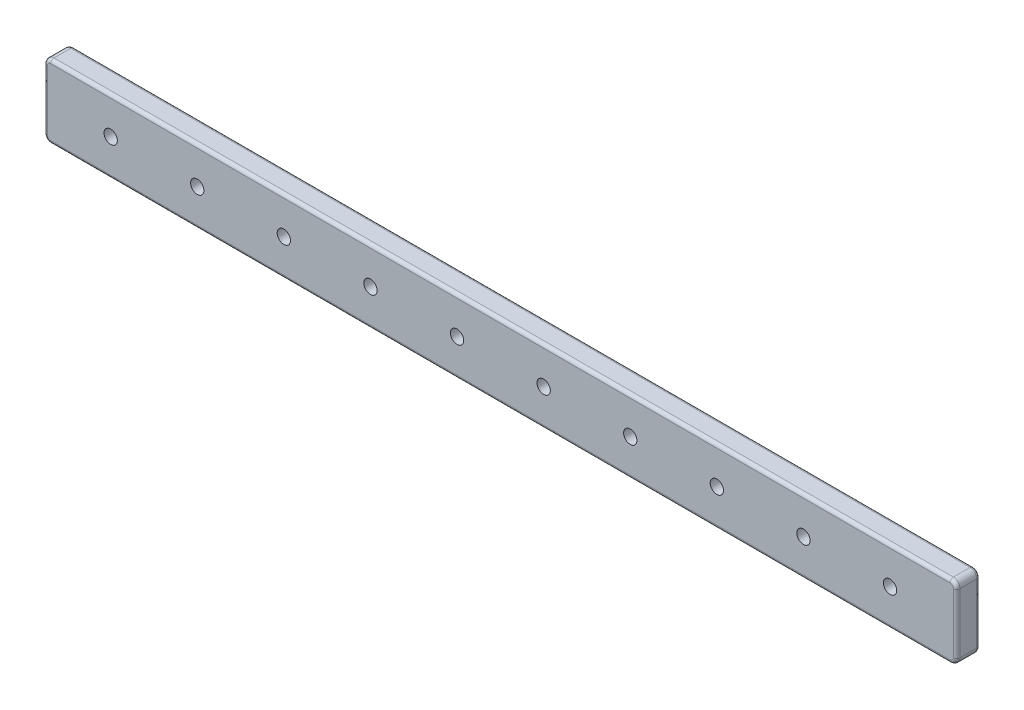
ISO-10303-21;
HEADER;
FILE_DESCRIPTION(('STEP AP214'),'2;1');
FILE_NAME('part.step','',(''),(''),'','','');
FILE_SCHEMA(('AUTOMOTIVE_DESIGN { 1 0 10303 214 1 1 1 1 }'));
ENDSEC;
DATA;
#1=APPLICATION_CONTEXT('core data for automotive mechanical design processes');
#2=APPLICATION_PROTOCOL_DEFINITION('international standard','automotive_design',2000,#1);
#3=PRODUCT_CONTEXT('',#1,'mechanical');
#4=PRODUCT('Part','Part','',(#3));
#5=PRODUCT_RELATED_PRODUCT_CATEGORY('part','',(#4));
#6=PRODUCT_DEFINITION_FORMATION('','',#4);
#7=PRODUCT_DEFINITION_CONTEXT('part definition',#1,'design');
#8=PRODUCT_DEFINITION('design','',#6,#7);
#9=PRODUCT_DEFINITION_SHAPE('','',#8);
#10=(LENGTH_UNIT() NAMED_UNIT(*) SI_UNIT(.MILLI.,.METRE.));
#11=(NAMED_UNIT(*) PLANE_ANGLE_UNIT() SI_UNIT($,.RADIAN.));
#12=(NAMED_UNIT(*) SI_UNIT($,.STERADIAN.) SOLID_ANGLE_UNIT());
#13=UNCERTAINTY_MEASURE_WITH_UNIT(LENGTH_MEASURE(1.E-05),#10,'distance_accuracy_value','');
#14=(GEOMETRIC_REPRESENTATION_CONTEXT(3) GLOBAL_UNCERTAINTY_ASSIGNED_CONTEXT((#13)) GLOBAL_UNIT_ASSIGNED_CONTEXT((#10,
#11,#12)) REPRESENTATION_CONTEXT('',''));
#15=CARTESIAN_POINT('',(0.,0.,0.));
#16=DIRECTION('',(0.,0.,1.));
#17=DIRECTION('',(1.,0.,0.));
#18=AXIS2_PLACEMENT_3D('',#15,#16,#17);
#19=CARTESIAN_POINT('',(-42.7961904761905,15.1352380952381,3.5));
#20=DIRECTION('',(1.,0.,0.));
#21=DIRECTION('',(0.,0.,-1.));
#22=AXIS2_PLACEMENT_3D('',#19,#20,#21);
#23=PLANE('',#22);
#24=DIRECTION('',(0.,0.,-1.));
#25=VECTOR('',#24,1.);
#26=CARTESIAN_POINT('',(-42.7961904761905,14.1352380952381,0.));
#27=LINE('',#26,#25);
#28=CARTESIAN_POINT('',(-42.7961904761905,14.1352380952381,3.));
#29=VERTEX_POINT('',#28);
#30=CARTESIAN_POINT('',(-42.7961904761905,14.1352380952381,0.5));
#31=VERTEX_POINT('',#30);
#32=EDGE_CURVE('E302',#29,#31,#27,.T.);
#33=ORIENTED_EDGE('',*,*,#32,.T.);
#34=DIRECTION('',(0.,-1.,0.));
#35=VECTOR('',#34,1.);
#36=CARTESIAN_POINT('',(-42.7961904761905,15.1352380952381,0.5));
#37=LINE('',#36,#35);
#38=CARTESIAN_POINT('',(-42.7961904761905,5.1352380952381,0.5));
#39=VERTEX_POINT('',#38);
#40=EDGE_CURVE('E200',#31,#39,#37,.T.);
#41=ORIENTED_EDGE('',*,*,#40,.T.);
#42=DIRECTION('',(0.,0.,-1.));
#43=VECTOR('',#42,1.);
#44=CARTESIAN_POINT('',(-42.7961904761905,5.1352380952381,3.5));
#45=LINE('',#44,#43);
#46=CARTESIAN_POINT('',(-42.7961904761905,5.1352380952381,3.));
#47=VERTEX_POINT('',#46);
#48=EDGE_CURVE('E312',#39,#47,#45,.F.);
#49=ORIENTED_EDGE('',*,*,#48,.T.);
#50=DIRECTION('',(0.,-1.,0.));
#51=VECTOR('',#50,1.);
#52=CARTESIAN_POINT('',(-42.7961904761905,14.1352380952381,3.));
#53=LINE('',#52,#51);
#54=EDGE_CURVE('E198',#47,#29,#53,.F.);
#55=ORIENTED_EDGE('',*,*,#54,.T.);
#56=EDGE_LOOP('',(#33,#41,#49,#55));
#57=FACE_BOUND('',#56,.T.);
#58=ADVANCED_FACE('F46',(#57),#23,.F.);
#59=CARTESIAN_POINT('',(-42.7961904761905,4.13523809523809,3.5));
#60=DIRECTION('',(0.,1.,0.));
#61=DIRECTION('',(0.,0.,1.));
#62=AXIS2_PLACEMENT_3D('',#59,#60,#61);
#63=PLANE('',#62);
#64=DIRECTION('',(0.,0.,-1.));
#65=VECTOR('',#64,1.);
#66=CARTESIAN_POINT('',(-41.7961904761905,4.13523809523809,3.5));
#67=LINE('',#66,#65);
#68=CARTESIAN_POINT('',(-41.7961904761905,4.13523809523809,3.));
#69=VERTEX_POINT('',#68);
#70=CARTESIAN_POINT('',(-41.7961904761905,4.13523809523809,0.5));
#71=VERTEX_POINT('',#70);
#72=EDGE_CURVE('E299',#69,#71,#67,.T.);
#73=ORIENTED_EDGE('',*,*,#72,.T.);
#74=DIRECTION('',(1.,0.,0.));
#75=VECTOR('',#74,1.);
#76=CARTESIAN_POINT('',(-42.7961904761905,4.13523809523809,0.5));
#77=LINE('',#76,#75);
#78=CARTESIAN_POINT('',(93.2038095238095,4.13523809523809,0.5));
#79=VERTEX_POINT('',#78);
#80=EDGE_CURVE('E208',#71,#79,#77,.T.);
#81=ORIENTED_EDGE('',*,*,#80,.T.);
#82=DIRECTION('',(0.,0.,-1.));
#83=VECTOR('',#82,1.);
#84=CARTESIAN_POINT('',(93.2038095238095,4.13523809523809,3.5));
#85=LINE('',#84,#83);
#86=CARTESIAN_POINT('',(93.2038095238095,4.13523809523809,3.));
#87=VERTEX_POINT('',#86);
#88=EDGE_CURVE('E291',#79,#87,#85,.F.);
#89=ORIENTED_EDGE('',*,*,#88,.T.);
#90=DIRECTION('',(1.,0.,0.));
#91=VECTOR('',#90,1.);
#92=CARTESIAN_POINT('',(-41.7961904761905,4.13523809523809,3.));
#93=LINE('',#92,#91);
#94=EDGE_CURVE('E206',#87,#69,#93,.F.);
#95=ORIENTED_EDGE('',*,*,#94,.T.);
#96=EDGE_LOOP('',(#73,#81,#89,#95));
#97=FACE_BOUND('',#96,.T.);
#98=ADVANCED_FACE('F296',(#97),#63,.F.);
#99=CARTESIAN_POINT('',(94.2038095238095,15.1352380952381,3.5));
#100=DIRECTION('',(1.,0.,0.));
#101=DIRECTION('',(0.,0.,-1.));
#102=AXIS2_PLACEMENT_3D('',#99,#100,#101);
#103=PLANE('',#102);
#104=DIRECTION('',(0.,0.,-1.));
#105=VECTOR('',#104,1.);
#106=CARTESIAN_POINT('',(94.2038095238095,5.1352380952381,0.));
#107=LINE('',#106,#105);
#108=CARTESIAN_POINT('',(94.2038095238095,5.1352380952381,3.));
#109=VERTEX_POINT('',#108);
#110=CARTESIAN_POINT('',(94.2038095238095,5.1352380952381,0.5));
#111=VERTEX_POINT('',#110);
#112=EDGE_CURVE('E182',#109,#111,#107,.T.);
#113=ORIENTED_EDGE('',*,*,#112,.T.);
#114=DIRECTION('',(0.,-1.,0.));
#115=VECTOR('',#114,1.);
#116=CARTESIAN_POINT('',(94.2038095238095,14.1352380952381,0.5));
#117=LINE('',#116,#115);
#118=CARTESIAN_POINT('',(94.2038095238095,14.1352380952381,0.5));
#119=VERTEX_POINT('',#118);
#120=EDGE_CURVE('E216',#111,#119,#117,.F.);
#121=ORIENTED_EDGE('',*,*,#120,.T.);
#122=DIRECTION('',(0.,0.,-1.));
#123=VECTOR('',#122,1.);
#124=CARTESIAN_POINT('',(94.2038095238095,14.1352380952381,3.5));
#125=LINE('',#124,#123);
#126=CARTESIAN_POINT('',(94.2038095238095,14.1352380952381,3.));
#127=VERTEX_POINT('',#126);
#128=EDGE_CURVE('E321',#119,#127,#125,.F.);
#129=ORIENTED_EDGE('',*,*,#128,.T.);
#130=DIRECTION('',(0.,-1.,0.));
#131=VECTOR('',#130,1.);
#132=CARTESIAN_POINT('',(94.2038095238095,15.1352380952381,3.));
#133=LINE('',#132,#131);
#134=EDGE_CURVE('E214',#127,#109,#133,.T.);
#135=ORIENTED_EDGE('',*,*,#134,.T.);
#136=EDGE_LOOP('',(#113,#121,#129,#135));
#137=FACE_BOUND('',#136,.T.);
#138=ADVANCED_FACE('F395',(#137),#103,.T.);
#139=CARTESIAN_POINT('',(-42.7961904761905,15.1352380952381,3.5));
#140=DIRECTION('',(0.,1.,0.));
#141=DIRECTION('',(0.,0.,1.));
#142=AXIS2_PLACEMENT_3D('',#139,#140,#141);
#143=PLANE('',#142);
#144=DIRECTION('',(0.,0.,-1.));
#145=VECTOR('',#144,1.);
#146=CARTESIAN_POINT('',(93.2038095238095,15.1352380952381,3.5));
#147=LINE('',#146,#145);
#148=CARTESIAN_POINT('',(93.2038095238095,15.1352380952381,3.));
#149=VERTEX_POINT('',#148);
#150=CARTESIAN_POINT('',(93.2038095238095,15.1352380952381,0.5));
#151=VERTEX_POINT('',#150);
#152=EDGE_CURVE('E315',#149,#151,#147,.T.);
#153=ORIENTED_EDGE('',*,*,#152,.T.);
#154=DIRECTION('',(1.,0.,0.));
#155=VECTOR('',#154,1.);
#156=CARTESIAN_POINT('',(-41.7961904761905,15.1352380952381,0.5));
#157=LINE('',#156,#155);
#158=CARTESIAN_POINT('',(-41.7961904761905,15.1352380952381,0.5));
#159=VERTEX_POINT('',#158);
#160=EDGE_CURVE('E11',#151,#159,#157,.F.);
#161=ORIENTED_EDGE('',*,*,#160,.T.);
#162=DIRECTION('',(0.,0.,-1.));
#163=VECTOR('',#162,1.);
#164=CARTESIAN_POINT('',(-41.7961904761905,15.1352380952381,3.5));
#165=LINE('',#164,#163);
#166=CARTESIAN_POINT('',(-41.7961904761905,15.1352380952381,3.));
#167=VERTEX_POINT('',#166);
#168=EDGE_CURVE('E318',#159,#167,#165,.F.);
#169=ORIENTED_EDGE('',*,*,#168,.T.);
#170=DIRECTION('',(1.,0.,0.));
#171=VECTOR('',#170,1.);
#172=CARTESIAN_POINT('',(-42.7961904761905,15.1352380952381,3.));
#173=LINE('',#172,#171);
#174=EDGE_CURVE('E55',#167,#149,#173,.T.);
#175=ORIENTED_EDGE('',*,*,#174,.T.);
#176=EDGE_LOOP('',(#153,#161,#169,#175));
#177=FACE_BOUND('',#176,.T.);
#178=ADVANCED_FACE('F362',(#177),#143,.T.);
#179=CARTESIAN_POINT('',(0.,0.,3.5));
#180=DIRECTION('',(0.,0.,1.));
#181=DIRECTION('',(1.,0.,0.));
#182=AXIS2_PLACEMENT_3D('',#179,#180,#181);
#183=PLANE('',#182);
#184=DIRECTION('',(1.,0.,0.));
#185=VECTOR('',#184,1.);
#186=CARTESIAN_POINT('',(0.,14.6352380952381,3.5));
#187=LINE('',#186,#185);
#188=CARTESIAN_POINT('',(93.2038095238095,14.6352380952381,3.5));
#189=VERTEX_POINT('',#188);
#190=CARTESIAN_POINT('',(-41.7961904761905,14.6352380952381,3.5));
#191=VERTEX_POINT('',#190);
#192=EDGE_CURVE('E222',#189,#191,#187,.F.);
#193=ORIENTED_EDGE('',*,*,#192,.T.);
#194=CARTESIAN_POINT('',(-41.7961904761905,14.1352380952381,3.5));
#195=DIRECTION('',(0.,0.,1.));
#196=DIRECTION('',(1.,0.,0.));
#197=AXIS2_PLACEMENT_3D('',#194,#195,#196);
#198=CIRCLE('',#197,0.5);
#199=CARTESIAN_POINT('',(-42.2961904761905,14.1352380952381,3.5));
#200=VERTEX_POINT('',#199);
#201=EDGE_CURVE('E235',#191,#200,#198,.T.);
#202=ORIENTED_EDGE('',*,*,#201,.T.);
#203=DIRECTION('',(0.,-1.,0.));
#204=VECTOR('',#203,1.);
#205=CARTESIAN_POINT('',(-42.2961904761905,5.1352380952381,3.5));
#206=LINE('',#205,#204);
#207=CARTESIAN_POINT('',(-42.2961904761905,5.1352380952381,3.5));
#208=VERTEX_POINT('',#207);
#209=EDGE_CURVE('E70',#200,#208,#206,.T.);
#210=ORIENTED_EDGE('',*,*,#209,.T.);
#211=CARTESIAN_POINT('',(-41.7961904761905,5.13523809523809,3.5));
#212=DIRECTION('',(0.,0.,1.));
#213=DIRECTION('',(1.,0.,0.));
#214=AXIS2_PLACEMENT_3D('',#211,#212,#213);
#215=CIRCLE('',#214,0.5);
#216=CARTESIAN_POINT('',(-41.7961904761905,4.63523809523809,3.5));
#217=VERTEX_POINT('',#216);
#218=EDGE_CURVE('E232',#208,#217,#215,.T.);
#219=ORIENTED_EDGE('',*,*,#218,.T.);
#220=DIRECTION('',(1.,0.,0.));
#221=VECTOR('',#220,1.);
#222=CARTESIAN_POINT('',(93.2038095238095,4.63523809523809,3.5));
#223=LINE('',#222,#221);
#224=CARTESIAN_POINT('',(93.2038095238095,4.63523809523809,3.5));
#225=VERTEX_POINT('',#224);
#226=EDGE_CURVE('E230',#217,#225,#223,.T.);
#227=ORIENTED_EDGE('',*,*,#226,.T.);
#228=CARTESIAN_POINT('',(93.2038095238095,5.1352380952381,3.5));
#229=DIRECTION('',(0.,0.,1.));
#230=DIRECTION('',(1.,0.,0.));
#231=AXIS2_PLACEMENT_3D('',#228,#229,#230);
#232=CIRCLE('',#231,0.5);
#233=CARTESIAN_POINT('',(93.7038095238095,5.1352380952381,3.5));
#234=VERTEX_POINT('',#233);
#235=EDGE_CURVE('E228',#225,#234,#232,.T.);
#236=ORIENTED_EDGE('',*,*,#235,.T.);
#237=DIRECTION('',(0.,-1.,0.));
#238=VECTOR('',#237,1.);
#239=CARTESIAN_POINT('',(93.7038095238095,0.,3.5));
#240=LINE('',#239,#238);
#241=CARTESIAN_POINT('',(93.7038095238095,14.1352380952381,3.5));
#242=VERTEX_POINT('',#241);
#243=EDGE_CURVE('E226',#234,#242,#240,.F.);
#244=ORIENTED_EDGE('',*,*,#243,.T.);
#245=CARTESIAN_POINT('',(93.2038095238095,14.1352380952381,3.5));
#246=DIRECTION('',(0.,0.,1.));
#247=DIRECTION('',(1.,0.,0.));
#248=AXIS2_PLACEMENT_3D('',#245,#246,#247);
#249=CIRCLE('',#248,0.5);
#250=EDGE_CURVE('E224',#242,#189,#249,.T.);
#251=ORIENTED_EDGE('',*,*,#250,.T.);
#252=EDGE_LOOP('',(#193,#202,#210,#219,#227,#236,#244,#251));
#253=FACE_BOUND('',#252,.T.);
#254=CARTESIAN_POINT('',(84.2038095238095,9.63523809523809,3.5));
#255=DIRECTION('',(0.,0.,-1.));
#256=DIRECTION('',(-1.,0.,0.));
#257=AXIS2_PLACEMENT_3D('',#254,#255,#256);
#258=CIRCLE('',#257,0.999999999999998);
#259=CARTESIAN_POINT('',(83.2038095238095,9.63523809523809,3.5));
#260=VERTEX_POINT('',#259);
#261=EDGE_CURVE('E300',#260,#260,#258,.T.);
#262=ORIENTED_EDGE('',*,*,#261,.T.);
#263=EDGE_LOOP('',(#262));
#264=FACE_BOUND('',#263,.T.);
#265=CARTESIAN_POINT('',(71.2038095238095,9.63523809523809,3.5));
#266=DIRECTION('',(0.,0.,-1.));
#267=DIRECTION('',(-1.,0.,0.));
#268=AXIS2_PLACEMENT_3D('',#265,#266,#267);
#269=CIRCLE('',#268,0.999999999999998);
#270=CARTESIAN_POINT('',(70.2038095238095,9.63523809523809,3.5));
#271=VERTEX_POINT('',#270);
#272=EDGE_CURVE('E862',#271,#271,#269,.T.);
#273=ORIENTED_EDGE('',*,*,#272,.T.);
#274=EDGE_LOOP('',(#273));
#275=FACE_BOUND('',#274,.T.);
#276=CARTESIAN_POINT('',(58.2038095238095,9.63523809523809,3.5));
#277=DIRECTION('',(0.,0.,-1.));
#278=DIRECTION('',(-1.,0.,0.));
#279=AXIS2_PLACEMENT_3D('',#276,#277,#278);
#280=CIRCLE('',#279,0.999999999999998);
#281=CARTESIAN_POINT('',(57.2038095238095,9.63523809523809,3.5));
#282=VERTEX_POINT('',#281);
#283=EDGE_CURVE('E870',#282,#282,#280,.T.);
#284=ORIENTED_EDGE('',*,*,#283,.T.);
#285=EDGE_LOOP('',(#284));
#286=FACE_BOUND('',#285,.T.);
#287=CARTESIAN_POINT('',(45.2038095238095,9.63523809523809,3.5));
#288=DIRECTION('',(0.,0.,-1.));
#289=DIRECTION('',(-1.,0.,0.));
#290=AXIS2_PLACEMENT_3D('',#287,#288,#289);
#291=CIRCLE('',#290,0.999999999999998);
#292=CARTESIAN_POINT('',(44.2038095238095,9.63523809523809,3.5));
#293=VERTEX_POINT('',#292);
#294=EDGE_CURVE('E876',#293,#293,#291,.T.);
#295=ORIENTED_EDGE('',*,*,#294,.T.);
#296=EDGE_LOOP('',(#295));
#297=FACE_BOUND('',#296,.T.);
#298=CARTESIAN_POINT('',(32.2038095238095,9.63523809523809,3.5));
#299=DIRECTION('',(0.,0.,-1.));
#300=DIRECTION('',(-1.,0.,0.));
#301=AXIS2_PLACEMENT_3D('',#298,#299,#300);
#302=CIRCLE('',#301,0.999999999999998);
#303=CARTESIAN_POINT('',(31.2038095238095,9.63523809523809,3.5));
#304=VERTEX_POINT('',#303);
#305=EDGE_CURVE('E882',#304,#304,#302,.T.);
#306=ORIENTED_EDGE('',*,*,#305,.T.);
#307=EDGE_LOOP('',(#306));
#308=FACE_BOUND('',#307,.T.);
#309=CARTESIAN_POINT('',(19.2038095238095,9.63523809523809,3.5));
#310=DIRECTION('',(0.,0.,-1.));
#311=DIRECTION('',(-1.,0.,0.));
#312=AXIS2_PLACEMENT_3D('',#309,#310,#311);
#313=CIRCLE('',#312,0.999999999999998);
#314=CARTESIAN_POINT('',(18.2038095238095,9.63523809523809,3.5));
#315=VERTEX_POINT('',#314);
#316=EDGE_CURVE('E888',#315,#315,#313,.T.);
#317=ORIENTED_EDGE('',*,*,#316,.T.);
#318=EDGE_LOOP('',(#317));
#319=FACE_BOUND('',#318,.T.);
#320=CARTESIAN_POINT('',(6.20380952380951,9.63523809523809,3.5));
#321=DIRECTION('',(0.,0.,-1.));
#322=DIRECTION('',(-1.,0.,0.));
#323=AXIS2_PLACEMENT_3D('',#320,#321,#322);
#324=CIRCLE('',#323,0.999999999999998);
#325=CARTESIAN_POINT('',(5.20380952380952,9.63523809523809,3.5));
#326=VERTEX_POINT('',#325);
#327=EDGE_CURVE('E894',#326,#326,#324,.T.);
#328=ORIENTED_EDGE('',*,*,#327,.T.);
#329=EDGE_LOOP('',(#328));
#330=FACE_BOUND('',#329,.T.);
#331=CARTESIAN_POINT('',(-6.79619047619048,9.63523809523809,3.5));
#332=DIRECTION('',(0.,0.,-1.));
#333=DIRECTION('',(-1.,0.,0.));
#334=AXIS2_PLACEMENT_3D('',#331,#332,#333);
#335=CIRCLE('',#334,0.999999999999998);
#336=CARTESIAN_POINT('',(-7.79619047619048,9.63523809523809,3.5));
#337=VERTEX_POINT('',#336);
#338=EDGE_CURVE('E900',#337,#337,#335,.T.);
#339=ORIENTED_EDGE('',*,*,#338,.T.);
#340=EDGE_LOOP('',(#339));
#341=FACE_BOUND('',#340,.T.);
#342=CARTESIAN_POINT('',(-19.7961904761905,9.63523809523809,3.5));
#343=DIRECTION('',(0.,0.,-1.));
#344=DIRECTION('',(-1.,0.,0.));
#345=AXIS2_PLACEMENT_3D('',#342,#343,#344);
#346=CIRCLE('',#345,0.999999999999998);
#347=CARTESIAN_POINT('',(-20.7961904761905,9.63523809523809,3.5));
#348=VERTEX_POINT('',#347);
#349=EDGE_CURVE('E906',#348,#348,#346,.T.);
#350=ORIENTED_EDGE('',*,*,#349,.T.);
#351=EDGE_LOOP('',(#350));
#352=FACE_BOUND('',#351,.T.);
#353=CARTESIAN_POINT('',(-32.7961904761905,9.63523809523809,3.5));
#354=DIRECTION('',(0.,0.,-1.));
#355=DIRECTION('',(-1.,0.,0.));
#356=AXIS2_PLACEMENT_3D('',#353,#354,#355);
#357=CIRCLE('',#356,0.999999999999998);
#358=CARTESIAN_POINT('',(-33.7961904761905,9.63523809523809,3.5));
#359=VERTEX_POINT('',#358);
#360=EDGE_CURVE('E255',#359,#359,#357,.T.);
#361=ORIENTED_EDGE('',*,*,#360,.T.);
#362=EDGE_LOOP('',(#361));
#363=FACE_BOUND('',#362,.T.);
#364=ADVANCED_FACE('F351',(#253,#264,#275,#286,#297,#308,#319,#330,#341,#352,#363),#183,.T.);
#365=CARTESIAN_POINT('',(0.,0.,0.));
#366=DIRECTION('',(0.,0.,1.));
#367=DIRECTION('',(1.,0.,0.));
#368=AXIS2_PLACEMENT_3D('',#365,#366,#367);
#369=PLANE('',#368);
#370=DIRECTION('',(0.,-1.,0.));
#371=VECTOR('',#370,1.);
#372=CARTESIAN_POINT('',(-42.2961904761905,0.,0.));
#373=LINE('',#372,#371);
#374=CARTESIAN_POINT('',(-42.2961904761905,5.1352380952381,0.));
#375=VERTEX_POINT('',#374);
#376=CARTESIAN_POINT('',(-42.2961904761905,14.1352380952381,0.));
#377=VERTEX_POINT('',#376);
#378=EDGE_CURVE('E187',#375,#377,#373,.F.);
#379=ORIENTED_EDGE('',*,*,#378,.T.);
#380=CARTESIAN_POINT('',(-41.7961904761905,14.1352380952381,0.));
#381=DIRECTION('',(0.,0.,1.));
#382=DIRECTION('',(1.,0.,0.));
#383=AXIS2_PLACEMENT_3D('',#380,#381,#382);
#384=CIRCLE('',#383,0.5);
#385=CARTESIAN_POINT('',(-41.7961904761905,14.6352380952381,0.));
#386=VERTEX_POINT('',#385);
#387=EDGE_CURVE('E167',#377,#386,#384,.F.);
#388=ORIENTED_EDGE('',*,*,#387,.T.);
#389=DIRECTION('',(1.,0.,0.));
#390=VECTOR('',#389,1.);
#391=CARTESIAN_POINT('',(93.2038095238095,14.6352380952381,0.));
#392=LINE('',#391,#390);
#393=CARTESIAN_POINT('',(93.2038095238095,14.6352380952381,0.));
#394=VERTEX_POINT('',#393);
#395=EDGE_CURVE('E175',#386,#394,#392,.T.);
#396=ORIENTED_EDGE('',*,*,#395,.T.);
#397=CARTESIAN_POINT('',(93.2038095238095,14.1352380952381,0.));
#398=DIRECTION('',(0.,0.,1.));
#399=DIRECTION('',(1.,0.,0.));
#400=AXIS2_PLACEMENT_3D('',#397,#398,#399);
#401=CIRCLE('',#400,0.5);
#402=CARTESIAN_POINT('',(93.7038095238095,14.1352380952381,0.));
#403=VERTEX_POINT('',#402);
#404=EDGE_CURVE('E181',#394,#403,#401,.F.);
#405=ORIENTED_EDGE('',*,*,#404,.T.);
#406=DIRECTION('',(0.,-1.,0.));
#407=VECTOR('',#406,1.);
#408=CARTESIAN_POINT('',(93.7038095238095,5.1352380952381,0.));
#409=LINE('',#408,#407);
#410=CARTESIAN_POINT('',(93.7038095238095,5.1352380952381,0.));
#411=VERTEX_POINT('',#410);
#412=EDGE_CURVE('E326',#403,#411,#409,.T.);
#413=ORIENTED_EDGE('',*,*,#412,.T.);
#414=CARTESIAN_POINT('',(93.2038095238095,5.1352380952381,0.));
#415=DIRECTION('',(0.,0.,1.));
#416=DIRECTION('',(1.,0.,0.));
#417=AXIS2_PLACEMENT_3D('',#414,#415,#416);
#418=CIRCLE('',#417,0.5);
#419=CARTESIAN_POINT('',(93.2038095238095,4.63523809523809,0.));
#420=VERTEX_POINT('',#419);
#421=EDGE_CURVE('E328',#411,#420,#418,.F.);
#422=ORIENTED_EDGE('',*,*,#421,.T.);
#423=DIRECTION('',(1.,0.,0.));
#424=VECTOR('',#423,1.);
#425=CARTESIAN_POINT('',(0.,4.63523809523809,0.));
#426=LINE('',#425,#424);
#427=CARTESIAN_POINT('',(-41.7961904761905,4.63523809523809,0.));
#428=VERTEX_POINT('',#427);
#429=EDGE_CURVE('E330',#420,#428,#426,.F.);
#430=ORIENTED_EDGE('',*,*,#429,.T.);
#431=CARTESIAN_POINT('',(-41.7961904761905,5.13523809523809,0.));
#432=DIRECTION('',(0.,0.,1.));
#433=DIRECTION('',(1.,0.,0.));
#434=AXIS2_PLACEMENT_3D('',#431,#432,#433);
#435=CIRCLE('',#434,0.5);
#436=EDGE_CURVE('E193',#428,#375,#435,.F.);
#437=ORIENTED_EDGE('',*,*,#436,.T.);
#438=EDGE_LOOP('',(#379,#388,#396,#405,#413,#422,#430,#437));
#439=FACE_BOUND('',#438,.T.);
#440=CARTESIAN_POINT('',(84.2038095238095,9.63523809523809,0.));
#441=DIRECTION('',(0.,0.,-1.));
#442=DIRECTION('',(-1.,0.,0.));
#443=AXIS2_PLACEMENT_3D('',#440,#441,#442);
#444=CIRCLE('',#443,0.999999999999998);
#445=CARTESIAN_POINT('',(83.2038095238095,9.63523809523809,0.));
#446=VERTEX_POINT('',#445);
#447=EDGE_CURVE('E305',#446,#446,#444,.T.);
#448=ORIENTED_EDGE('',*,*,#447,.F.);
#449=EDGE_LOOP('',(#448));
#450=FACE_BOUND('',#449,.T.);
#451=CARTESIAN_POINT('',(71.2038095238095,9.63523809523809,0.));
#452=DIRECTION('',(0.,0.,-1.));
#453=DIRECTION('',(-1.,0.,0.));
#454=AXIS2_PLACEMENT_3D('',#451,#452,#453);
#455=CIRCLE('',#454,0.999999999999998);
#456=CARTESIAN_POINT('',(70.2038095238095,9.63523809523809,0.));
#457=VERTEX_POINT('',#456);
#458=EDGE_CURVE('E859',#457,#457,#455,.T.);
#459=ORIENTED_EDGE('',*,*,#458,.F.);
#460=EDGE_LOOP('',(#459));
#461=FACE_BOUND('',#460,.T.);
#462=CARTESIAN_POINT('',(58.2038095238095,9.63523809523809,0.));
#463=DIRECTION('',(0.,0.,-1.));
#464=DIRECTION('',(-1.,0.,0.));
#465=AXIS2_PLACEMENT_3D('',#462,#463,#464);
#466=CIRCLE('',#465,0.999999999999998);
#467=CARTESIAN_POINT('',(57.2038095238095,9.63523809523809,0.));
#468=VERTEX_POINT('',#467);
#469=EDGE_CURVE('E867',#468,#468,#466,.T.);
#470=ORIENTED_EDGE('',*,*,#469,.F.);
#471=EDGE_LOOP('',(#470));
#472=FACE_BOUND('',#471,.T.);
#473=CARTESIAN_POINT('',(45.2038095238095,9.63523809523809,0.));
#474=DIRECTION('',(0.,0.,-1.));
#475=DIRECTION('',(-1.,0.,0.));
#476=AXIS2_PLACEMENT_3D('',#473,#474,#475);
#477=CIRCLE('',#476,0.999999999999998);
#478=CARTESIAN_POINT('',(44.2038095238095,9.63523809523809,0.));
#479=VERTEX_POINT('',#478);
#480=EDGE_CURVE('E873',#479,#479,#477,.T.);
#481=ORIENTED_EDGE('',*,*,#480,.F.);
#482=EDGE_LOOP('',(#481));
#483=FACE_BOUND('',#482,.T.);
#484=CARTESIAN_POINT('',(32.2038095238095,9.63523809523809,0.));
#485=DIRECTION('',(0.,0.,-1.));
#486=DIRECTION('',(-1.,0.,0.));
#487=AXIS2_PLACEMENT_3D('',#484,#485,#486);
#488=CIRCLE('',#487,0.999999999999998);
#489=CARTESIAN_POINT('',(31.2038095238095,9.63523809523809,0.));
#490=VERTEX_POINT('',#489);
#491=EDGE_CURVE('E879',#490,#490,#488,.T.);
#492=ORIENTED_EDGE('',*,*,#491,.F.);
#493=EDGE_LOOP('',(#492));
#494=FACE_BOUND('',#493,.T.);
#495=CARTESIAN_POINT('',(19.2038095238095,9.63523809523809,0.));
#496=DIRECTION('',(0.,0.,-1.));
#497=DIRECTION('',(-1.,0.,0.));
#498=AXIS2_PLACEMENT_3D('',#495,#496,#497);
#499=CIRCLE('',#498,0.999999999999998);
#500=CARTESIAN_POINT('',(18.2038095238095,9.63523809523809,0.));
#501=VERTEX_POINT('',#500);
#502=EDGE_CURVE('E885',#501,#501,#499,.T.);
#503=ORIENTED_EDGE('',*,*,#502,.F.);
#504=EDGE_LOOP('',(#503));
#505=FACE_BOUND('',#504,.T.);
#506=CARTESIAN_POINT('',(6.20380952380951,9.63523809523809,0.));
#507=DIRECTION('',(0.,0.,-1.));
#508=DIRECTION('',(-1.,0.,0.));
#509=AXIS2_PLACEMENT_3D('',#506,#507,#508);
#510=CIRCLE('',#509,0.999999999999998);
#511=CARTESIAN_POINT('',(5.20380952380952,9.63523809523809,0.));
#512=VERTEX_POINT('',#511);
#513=EDGE_CURVE('E891',#512,#512,#510,.T.);
#514=ORIENTED_EDGE('',*,*,#513,.F.);
#515=EDGE_LOOP('',(#514));
#516=FACE_BOUND('',#515,.T.);
#517=CARTESIAN_POINT('',(-6.79619047619048,9.63523809523809,0.));
#518=DIRECTION('',(0.,0.,-1.));
#519=DIRECTION('',(-1.,0.,0.));
#520=AXIS2_PLACEMENT_3D('',#517,#518,#519);
#521=CIRCLE('',#520,0.999999999999998);
#522=CARTESIAN_POINT('',(-7.79619047619048,9.63523809523809,0.));
#523=VERTEX_POINT('',#522);
#524=EDGE_CURVE('E897',#523,#523,#521,.T.);
#525=ORIENTED_EDGE('',*,*,#524,.F.);
#526=EDGE_LOOP('',(#525));
#527=FACE_BOUND('',#526,.T.);
#528=CARTESIAN_POINT('',(-19.7961904761905,9.63523809523809,0.));
#529=DIRECTION('',(0.,0.,-1.));
#530=DIRECTION('',(-1.,0.,0.));
#531=AXIS2_PLACEMENT_3D('',#528,#529,#530);
#532=CIRCLE('',#531,0.999999999999998);
#533=CARTESIAN_POINT('',(-20.7961904761905,9.63523809523809,0.));
#534=VERTEX_POINT('',#533);
#535=EDGE_CURVE('E903',#534,#534,#532,.T.);
#536=ORIENTED_EDGE('',*,*,#535,.F.);
#537=EDGE_LOOP('',(#536));
#538=FACE_BOUND('',#537,.T.);
#539=CARTESIAN_POINT('',(-32.7961904761905,9.63523809523809,0.));
#540=DIRECTION('',(0.,0.,-1.));
#541=DIRECTION('',(-1.,0.,0.));
#542=AXIS2_PLACEMENT_3D('',#539,#540,#541);
#543=CIRCLE('',#542,0.999999999999998);
#544=CARTESIAN_POINT('',(-33.7961904761905,9.63523809523809,0.));
#545=VERTEX_POINT('',#544);
#546=EDGE_CURVE('E908',#545,#545,#543,.T.);
#547=ORIENTED_EDGE('',*,*,#546,.F.);
#548=EDGE_LOOP('',(#547));
#549=FACE_BOUND('',#548,.T.);
#550=ADVANCED_FACE('F184',(#439,#450,#461,#472,#483,#494,#505,#516,#527,#538,#549),#369,.F.);
#551=CARTESIAN_POINT('',(-32.7961904761905,9.63523809523809,3.5));
#552=DIRECTION('',(0.,0.,-1.));
#553=DIRECTION('',(-1.,0.,0.));
#554=AXIS2_PLACEMENT_3D('',#551,#552,#553);
#555=CYLINDRICAL_SURFACE('',#554,0.999999999999998);
#556=ORIENTED_EDGE('',*,*,#360,.F.);
#557=EDGE_LOOP('',(#556));
#558=FACE_BOUND('',#557,.T.);
#559=ORIENTED_EDGE('',*,*,#546,.T.);
#560=EDGE_LOOP('',(#559));
#561=FACE_BOUND('',#560,.T.);
#562=ADVANCED_FACE('F601',(#558,#561),#555,.F.);
#563=CARTESIAN_POINT('',(-19.7961904761905,9.63523809523809,3.5));
#564=DIRECTION('',(0.,0.,-1.));
#565=DIRECTION('',(-1.,0.,0.));
#566=AXIS2_PLACEMENT_3D('',#563,#564,#565);
#567=CYLINDRICAL_SURFACE('',#566,0.999999999999998);
#568=ORIENTED_EDGE('',*,*,#349,.F.);
#569=EDGE_LOOP('',(#568));
#570=FACE_BOUND('',#569,.T.);
#571=ORIENTED_EDGE('',*,*,#535,.T.);
#572=EDGE_LOOP('',(#571));
#573=FACE_BOUND('',#572,.T.);
#574=ADVANCED_FACE('F672',(#570,#573),#567,.F.);
#575=CARTESIAN_POINT('',(-6.79619047619048,9.63523809523809,3.5));
#576=DIRECTION('',(0.,0.,-1.));
#577=DIRECTION('',(-1.,0.,0.));
#578=AXIS2_PLACEMENT_3D('',#575,#576,#577);
#579=CYLINDRICAL_SURFACE('',#578,0.999999999999998);
#580=ORIENTED_EDGE('',*,*,#338,.F.);
#581=EDGE_LOOP('',(#580));
#582=FACE_BOUND('',#581,.T.);
#583=ORIENTED_EDGE('',*,*,#524,.T.);
#584=EDGE_LOOP('',(#583));
#585=FACE_BOUND('',#584,.T.);
#586=ADVANCED_FACE('F683',(#582,#585),#579,.F.);
#587=CARTESIAN_POINT('',(6.20380952380951,9.63523809523809,3.5));
#588=DIRECTION('',(0.,0.,-1.));
#589=DIRECTION('',(-1.,0.,0.));
#590=AXIS2_PLACEMENT_3D('',#587,#588,#589);
#591=CYLINDRICAL_SURFACE('',#590,0.999999999999998);
#592=ORIENTED_EDGE('',*,*,#327,.F.);
#593=EDGE_LOOP('',(#592));
#594=FACE_BOUND('',#593,.T.);
#595=ORIENTED_EDGE('',*,*,#513,.T.);
#596=EDGE_LOOP('',(#595));
#597=FACE_BOUND('',#596,.T.);
#598=ADVANCED_FACE('F695',(#594,#597),#591,.F.);
#599=CARTESIAN_POINT('',(19.2038095238095,9.63523809523809,3.5));
#600=DIRECTION('',(0.,0.,-1.));
#601=DIRECTION('',(-1.,0.,0.));
#602=AXIS2_PLACEMENT_3D('',#599,#600,#601);
#603=CYLINDRICAL_SURFACE('',#602,0.999999999999998);
#604=ORIENTED_EDGE('',*,*,#316,.F.);
#605=EDGE_LOOP('',(#604));
#606=FACE_BOUND('',#605,.T.);
#607=ORIENTED_EDGE('',*,*,#502,.T.);
#608=EDGE_LOOP('',(#607));
#609=FACE_BOUND('',#608,.T.);
#610=ADVANCED_FACE('F707',(#606,#609),#603,.F.);
#611=CARTESIAN_POINT('',(32.2038095238095,9.63523809523809,3.5));
#612=DIRECTION('',(0.,0.,-1.));
#613=DIRECTION('',(-1.,0.,0.));
#614=AXIS2_PLACEMENT_3D('',#611,#612,#613);
#615=CYLINDRICAL_SURFACE('',#614,0.999999999999998);
#616=ORIENTED_EDGE('',*,*,#305,.F.);
#617=EDGE_LOOP('',(#616));
#618=FACE_BOUND('',#617,.T.);
#619=ORIENTED_EDGE('',*,*,#491,.T.);
#620=EDGE_LOOP('',(#619));
#621=FACE_BOUND('',#620,.T.);
#622=ADVANCED_FACE('F719',(#618,#621),#615,.F.);
#623=CARTESIAN_POINT('',(45.2038095238095,9.63523809523809,3.5));
#624=DIRECTION('',(0.,0.,-1.));
#625=DIRECTION('',(-1.,0.,0.));
#626=AXIS2_PLACEMENT_3D('',#623,#624,#625);
#627=CYLINDRICAL_SURFACE('',#626,0.999999999999998);
#628=ORIENTED_EDGE('',*,*,#294,.F.);
#629=EDGE_LOOP('',(#628));
#630=FACE_BOUND('',#629,.T.);
#631=ORIENTED_EDGE('',*,*,#480,.T.);
#632=EDGE_LOOP('',(#631));
#633=FACE_BOUND('',#632,.T.);
#634=ADVANCED_FACE('F731',(#630,#633),#627,.F.);
#635=CARTESIAN_POINT('',(58.2038095238095,9.63523809523809,3.5));
#636=DIRECTION('',(0.,0.,-1.));
#637=DIRECTION('',(-1.,0.,0.));
#638=AXIS2_PLACEMENT_3D('',#635,#636,#637);
#639=CYLINDRICAL_SURFACE('',#638,0.999999999999998);
#640=ORIENTED_EDGE('',*,*,#283,.F.);
#641=EDGE_LOOP('',(#640));
#642=FACE_BOUND('',#641,.T.);
#643=ORIENTED_EDGE('',*,*,#469,.T.);
#644=EDGE_LOOP('',(#643));
#645=FACE_BOUND('',#644,.T.);
#646=ADVANCED_FACE('F743',(#642,#645),#639,.F.);
#647=CARTESIAN_POINT('',(71.2038095238095,9.63523809523809,3.5));
#648=DIRECTION('',(0.,0.,-1.));
#649=DIRECTION('',(-1.,0.,0.));
#650=AXIS2_PLACEMENT_3D('',#647,#648,#649);
#651=CYLINDRICAL_SURFACE('',#650,0.999999999999998);
#652=ORIENTED_EDGE('',*,*,#272,.F.);
#653=EDGE_LOOP('',(#652));
#654=FACE_BOUND('',#653,.T.);
#655=ORIENTED_EDGE('',*,*,#458,.T.);
#656=EDGE_LOOP('',(#655));
#657=FACE_BOUND('',#656,.T.);
#658=ADVANCED_FACE('F755',(#654,#657),#651,.F.);
#659=CARTESIAN_POINT('',(84.2038095238095,9.63523809523809,3.5));
#660=DIRECTION('',(0.,0.,-1.));
#661=DIRECTION('',(-1.,0.,0.));
#662=AXIS2_PLACEMENT_3D('',#659,#660,#661);
#663=CYLINDRICAL_SURFACE('',#662,0.999999999999998);
#664=ORIENTED_EDGE('',*,*,#261,.F.);
#665=EDGE_LOOP('',(#664));
#666=FACE_BOUND('',#665,.T.);
#667=ORIENTED_EDGE('',*,*,#447,.T.);
#668=EDGE_LOOP('',(#667));
#669=FACE_BOUND('',#668,.T.);
#670=ADVANCED_FACE('F402',(#666,#669),#663,.F.);
#671=CARTESIAN_POINT('',(-41.7961904761905,5.13523809523809,3.5));
#672=DIRECTION('',(0.,0.,-1.));
#673=DIRECTION('',(-1.,0.,0.));
#674=AXIS2_PLACEMENT_3D('',#671,#672,#673);
#675=CYLINDRICAL_SURFACE('',#674,1.);
#676=ORIENTED_EDGE('',*,*,#48,.F.);
#677=CARTESIAN_POINT('',(-41.7961904761905,5.13523809523809,0.5));
#678=DIRECTION('',(0.,0.,1.));
#679=DIRECTION('',(1.,0.,0.));
#680=AXIS2_PLACEMENT_3D('',#677,#678,#679);
#681=CIRCLE('',#680,1.);
#682=EDGE_CURVE('E204',#39,#71,#681,.T.);
#683=ORIENTED_EDGE('',*,*,#682,.T.);
#684=ORIENTED_EDGE('',*,*,#72,.F.);
#685=CARTESIAN_POINT('',(-41.7961904761905,5.13523809523809,3.));
#686=DIRECTION('',(0.,0.,1.));
#687=DIRECTION('',(1.,0.,0.));
#688=AXIS2_PLACEMENT_3D('',#685,#686,#687);
#689=CIRCLE('',#688,1.);
#690=EDGE_CURVE('E202',#69,#47,#689,.F.);
#691=ORIENTED_EDGE('',*,*,#690,.T.);
#692=EDGE_LOOP('',(#676,#683,#684,#691));
#693=FACE_BOUND('',#692,.T.);
#694=ADVANCED_FACE('F399',(#693),#675,.T.);
#695=CARTESIAN_POINT('',(-41.7961904761905,14.1352380952381,3.5));
#696=DIRECTION('',(0.,0.,1.));
#697=DIRECTION('',(1.,0.,0.));
#698=AXIS2_PLACEMENT_3D('',#695,#696,#697);
#699=CYLINDRICAL_SURFACE('',#698,1.);
#700=ORIENTED_EDGE('',*,*,#168,.F.);
#701=CARTESIAN_POINT('',(-41.7961904761905,14.1352380952381,0.5));
#702=DIRECTION('',(0.,0.,1.));
#703=DIRECTION('',(1.,0.,0.));
#704=AXIS2_PLACEMENT_3D('',#701,#702,#703);
#705=CIRCLE('',#704,1.);
#706=EDGE_CURVE('E169',#159,#31,#705,.T.);
#707=ORIENTED_EDGE('',*,*,#706,.T.);
#708=ORIENTED_EDGE('',*,*,#32,.F.);
#709=CARTESIAN_POINT('',(-41.7961904761905,14.1352380952381,3.));
#710=DIRECTION('',(0.,0.,1.));
#711=DIRECTION('',(1.,0.,0.));
#712=AXIS2_PLACEMENT_3D('',#709,#710,#711);
#713=CIRCLE('',#712,1.);
#714=EDGE_CURVE('E189',#29,#167,#713,.F.);
#715=ORIENTED_EDGE('',*,*,#714,.T.);
#716=EDGE_LOOP('',(#700,#707,#708,#715));
#717=FACE_BOUND('',#716,.T.);
#718=ADVANCED_FACE('F346',(#717),#699,.T.);
#719=CARTESIAN_POINT('',(93.2038095238095,5.1352380952381,3.5));
#720=DIRECTION('',(0.,0.,1.));
#721=DIRECTION('',(1.,0.,0.));
#722=AXIS2_PLACEMENT_3D('',#719,#720,#721);
#723=CYLINDRICAL_SURFACE('',#722,1.);
#724=ORIENTED_EDGE('',*,*,#88,.F.);
#725=CARTESIAN_POINT('',(93.2038095238095,5.1352380952381,0.5));
#726=DIRECTION('',(0.,0.,1.));
#727=DIRECTION('',(1.,0.,0.));
#728=AXIS2_PLACEMENT_3D('',#725,#726,#727);
#729=CIRCLE('',#728,1.);
#730=EDGE_CURVE('E212',#79,#111,#729,.T.);
#731=ORIENTED_EDGE('',*,*,#730,.T.);
#732=ORIENTED_EDGE('',*,*,#112,.F.);
#733=CARTESIAN_POINT('',(93.2038095238095,5.1352380952381,3.));
#734=DIRECTION('',(0.,0.,1.));
#735=DIRECTION('',(1.,0.,0.));
#736=AXIS2_PLACEMENT_3D('',#733,#734,#735);
#737=CIRCLE('',#736,1.);
#738=EDGE_CURVE('E210',#109,#87,#737,.F.);
#739=ORIENTED_EDGE('',*,*,#738,.T.);
#740=EDGE_LOOP('',(#724,#731,#732,#739));
#741=FACE_BOUND('',#740,.T.);
#742=ADVANCED_FACE('F290',(#741),#723,.T.);
#743=CARTESIAN_POINT('',(93.2038095238095,14.1352380952381,3.5));
#744=DIRECTION('',(0.,0.,-1.));
#745=DIRECTION('',(-1.,0.,0.));
#746=AXIS2_PLACEMENT_3D('',#743,#744,#745);
#747=CYLINDRICAL_SURFACE('',#746,1.);
#748=ORIENTED_EDGE('',*,*,#128,.F.);
#749=CARTESIAN_POINT('',(93.2038095238095,14.1352380952381,0.5));
#750=DIRECTION('',(0.,0.,1.));
#751=DIRECTION('',(1.,0.,0.));
#752=AXIS2_PLACEMENT_3D('',#749,#750,#751);
#753=CIRCLE('',#752,1.);
#754=EDGE_CURVE('E220',#119,#151,#753,.T.);
#755=ORIENTED_EDGE('',*,*,#754,.T.);
#756=ORIENTED_EDGE('',*,*,#152,.F.);
#757=CARTESIAN_POINT('',(93.2038095238095,14.1352380952381,3.));
#758=DIRECTION('',(0.,0.,1.));
#759=DIRECTION('',(1.,0.,0.));
#760=AXIS2_PLACEMENT_3D('',#757,#758,#759);
#761=CIRCLE('',#760,1.);
#762=EDGE_CURVE('E218',#149,#127,#761,.F.);
#763=ORIENTED_EDGE('',*,*,#762,.T.);
#764=EDGE_LOOP('',(#748,#755,#756,#763));
#765=FACE_BOUND('',#764,.T.);
#766=ADVANCED_FACE('F387',(#765),#747,.T.);
#767=CARTESIAN_POINT('',(93.2038095238095,5.1352380952381,0.5));
#768=DIRECTION('',(0.,0.,1.));
#769=DIRECTION('',(1.,0.,0.));
#770=AXIS2_PLACEMENT_3D('',#767,#768,#769);
#771=DEGENERATE_TOROIDAL_SURFACE('',#770,0.5,0.5,.T.);
#772=CARTESIAN_POINT('',(93.7038095238095,5.1352380952381,0.5));
#773=DIRECTION('',(0.,1.,0.));
#774=DIRECTION('',(0.,0.,1.));
#775=AXIS2_PLACEMENT_3D('',#772,#773,#774);
#776=CIRCLE('',#775,0.5);
#777=EDGE_CURVE('E249',#111,#411,#776,.T.);
#778=ORIENTED_EDGE('',*,*,#777,.F.);
#779=ORIENTED_EDGE('',*,*,#730,.F.);
#780=CARTESIAN_POINT('',(93.2038095238095,4.63523809523809,0.5));
#781=DIRECTION('',(-1.,0.,0.));
#782=DIRECTION('',(0.,0.,1.));
#783=AXIS2_PLACEMENT_3D('',#780,#781,#782);
#784=CIRCLE('',#783,0.5);
#785=EDGE_CURVE('E252',#420,#79,#784,.T.);
#786=ORIENTED_EDGE('',*,*,#785,.F.);
#787=ORIENTED_EDGE('',*,*,#421,.F.);
#788=EDGE_LOOP('',(#778,#779,#786,#787));
#789=FACE_BOUND('',#788,.T.);
#790=ADVANCED_FACE('F376',(#789),#771,.T.);
#791=CARTESIAN_POINT('',(-42.7961904761905,4.63523809523809,0.5));
#792=DIRECTION('',(1.,0.,0.));
#793=DIRECTION('',(0.,0.,-1.));
#794=AXIS2_PLACEMENT_3D('',#791,#792,#793);
#795=CYLINDRICAL_SURFACE('',#794,0.5);
#796=ORIENTED_EDGE('',*,*,#785,.T.);
#797=ORIENTED_EDGE('',*,*,#80,.F.);
#798=CARTESIAN_POINT('',(-41.7961904761905,4.63523809523809,0.5));
#799=DIRECTION('',(-1.,0.,0.));
#800=DIRECTION('',(0.,0.,1.));
#801=AXIS2_PLACEMENT_3D('',#798,#799,#800);
#802=CIRCLE('',#801,0.5);
#803=EDGE_CURVE('E246',#428,#71,#802,.T.);
#804=ORIENTED_EDGE('',*,*,#803,.F.);
#805=ORIENTED_EDGE('',*,*,#429,.F.);
#806=EDGE_LOOP('',(#796,#797,#804,#805));
#807=FACE_BOUND('',#806,.T.);
#808=ADVANCED_FACE('F379',(#807),#795,.T.);
#809=CARTESIAN_POINT('',(93.7038095238095,0.,0.5));
#810=DIRECTION('',(0.,1.,0.));
#811=DIRECTION('',(0.,0.,1.));
#812=AXIS2_PLACEMENT_3D('',#809,#810,#811);
#813=CYLINDRICAL_SURFACE('',#812,0.5);
#814=ORIENTED_EDGE('',*,*,#777,.T.);
#815=ORIENTED_EDGE('',*,*,#412,.F.);
#816=CARTESIAN_POINT('',(93.7038095238095,14.1352380952381,0.5));
#817=DIRECTION('',(0.,1.,0.));
#818=DIRECTION('',(0.,0.,1.));
#819=AXIS2_PLACEMENT_3D('',#816,#817,#818);
#820=CIRCLE('',#819,0.5);
#821=EDGE_CURVE('E243',#119,#403,#820,.T.);
#822=ORIENTED_EDGE('',*,*,#821,.F.);
#823=ORIENTED_EDGE('',*,*,#120,.F.);
#824=EDGE_LOOP('',(#814,#815,#822,#823));
#825=FACE_BOUND('',#824,.T.);
#826=ADVANCED_FACE('F372',(#825),#813,.T.);
#827=CARTESIAN_POINT('',(-41.7961904761905,5.13523809523809,0.5));
#828=DIRECTION('',(0.,0.,1.));
#829=DIRECTION('',(1.,0.,0.));
#830=AXIS2_PLACEMENT_3D('',#827,#828,#829);
#831=DEGENERATE_TOROIDAL_SURFACE('',#830,0.5,0.5,.T.);
#832=ORIENTED_EDGE('',*,*,#803,.T.);
#833=ORIENTED_EDGE('',*,*,#682,.F.);
#834=CARTESIAN_POINT('',(-42.2961904761905,5.1352380952381,0.5));
#835=DIRECTION('',(0.,1.,0.));
#836=DIRECTION('',(0.,0.,1.));
#837=AXIS2_PLACEMENT_3D('',#834,#835,#836);
#838=CIRCLE('',#837,0.5);
#839=EDGE_CURVE('E240',#375,#39,#838,.T.);
#840=ORIENTED_EDGE('',*,*,#839,.F.);
#841=ORIENTED_EDGE('',*,*,#436,.F.);
#842=EDGE_LOOP('',(#832,#833,#840,#841));
#843=FACE_BOUND('',#842,.T.);
#844=ADVANCED_FACE('F337',(#843),#831,.T.);
#845=CARTESIAN_POINT('',(93.2038095238095,14.1352380952381,0.5));
#846=DIRECTION('',(0.,0.,1.));
#847=DIRECTION('',(1.,0.,0.));
#848=AXIS2_PLACEMENT_3D('',#845,#846,#847);
#849=DEGENERATE_TOROIDAL_SURFACE('',#848,0.5,0.5,.T.);
#850=ORIENTED_EDGE('',*,*,#821,.T.);
#851=ORIENTED_EDGE('',*,*,#404,.F.);
#852=CARTESIAN_POINT('',(93.2038095238095,14.6352380952381,0.5));
#853=DIRECTION('',(-1.,0.,0.));
#854=DIRECTION('',(0.,0.,1.));
#855=AXIS2_PLACEMENT_3D('',#852,#853,#854);
#856=CIRCLE('',#855,0.5);
#857=EDGE_CURVE('E178',#151,#394,#856,.T.);
#858=ORIENTED_EDGE('',*,*,#857,.F.);
#859=ORIENTED_EDGE('',*,*,#754,.F.);
#860=EDGE_LOOP('',(#850,#851,#858,#859));
#861=FACE_BOUND('',#860,.T.);
#862=ADVANCED_FACE('F367',(#861),#849,.T.);
#863=CARTESIAN_POINT('',(-42.2961904761905,15.1352380952381,0.5));
#864=DIRECTION('',(0.,-1.,0.));
#865=DIRECTION('',(0.,0.,-1.));
#866=AXIS2_PLACEMENT_3D('',#863,#864,#865);
#867=CYLINDRICAL_SURFACE('',#866,0.5);
#868=ORIENTED_EDGE('',*,*,#839,.T.);
#869=ORIENTED_EDGE('',*,*,#40,.F.);
#870=CARTESIAN_POINT('',(-42.2961904761905,14.1352380952381,0.5));
#871=DIRECTION('',(0.,1.,0.));
#872=DIRECTION('',(0.,0.,1.));
#873=AXIS2_PLACEMENT_3D('',#870,#871,#872);
#874=CIRCLE('',#873,0.5);
#875=EDGE_CURVE('E172',#377,#31,#874,.T.);
#876=ORIENTED_EDGE('',*,*,#875,.F.);
#877=ORIENTED_EDGE('',*,*,#378,.F.);
#878=EDGE_LOOP('',(#868,#869,#876,#877));
#879=FACE_BOUND('',#878,.T.);
#880=ADVANCED_FACE('F340',(#879),#867,.T.);
#881=CARTESIAN_POINT('',(0.,14.6352380952381,0.5));
#882=DIRECTION('',(-1.,0.,0.));
#883=DIRECTION('',(0.,0.,1.));
#884=AXIS2_PLACEMENT_3D('',#881,#882,#883);
#885=CYLINDRICAL_SURFACE('',#884,0.5);
#886=ORIENTED_EDGE('',*,*,#857,.T.);
#887=ORIENTED_EDGE('',*,*,#395,.F.);
#888=CARTESIAN_POINT('',(-41.7961904761905,14.6352380952381,0.5));
#889=DIRECTION('',(-1.,0.,0.));
#890=DIRECTION('',(0.,0.,1.));
#891=AXIS2_PLACEMENT_3D('',#888,#889,#890);
#892=CIRCLE('',#891,0.5);
#893=EDGE_CURVE('E163',#159,#386,#892,.T.);
#894=ORIENTED_EDGE('',*,*,#893,.F.);
#895=ORIENTED_EDGE('',*,*,#160,.F.);
#896=EDGE_LOOP('',(#886,#887,#894,#895));
#897=FACE_BOUND('',#896,.T.);
#898=ADVANCED_FACE('F176',(#897),#885,.T.);
#899=CARTESIAN_POINT('',(-41.7961904761905,14.1352380952381,0.5));
#900=DIRECTION('',(0.,0.,1.));
#901=DIRECTION('',(1.,0.,0.));
#902=AXIS2_PLACEMENT_3D('',#899,#900,#901);
#903=DEGENERATE_TOROIDAL_SURFACE('',#902,0.5,0.5,.T.);
#904=ORIENTED_EDGE('',*,*,#875,.T.);
#905=ORIENTED_EDGE('',*,*,#706,.F.);
#906=ORIENTED_EDGE('',*,*,#893,.T.);
#907=ORIENTED_EDGE('',*,*,#387,.F.);
#908=EDGE_LOOP('',(#904,#905,#906,#907));
#909=FACE_BOUND('',#908,.T.);
#910=ADVANCED_FACE('F165',(#909),#903,.T.);
#911=CARTESIAN_POINT('',(93.2038095238095,5.1352380952381,3.));
#912=DIRECTION('',(0.,0.,1.));
#913=DIRECTION('',(1.,0.,0.));
#914=AXIS2_PLACEMENT_3D('',#911,#912,#913);
#915=DEGENERATE_TOROIDAL_SURFACE('',#914,0.5,0.5,.T.);
#916=CARTESIAN_POINT('',(93.2038095238095,4.63523809523809,3.));
#917=DIRECTION('',(-1.,0.,0.));
#918=DIRECTION('',(0.,0.,1.));
#919=AXIS2_PLACEMENT_3D('',#916,#917,#918);
#920=CIRCLE('',#919,0.5);
#921=EDGE_CURVE('E270',#87,#225,#920,.T.);
#922=ORIENTED_EDGE('',*,*,#921,.F.);
#923=ORIENTED_EDGE('',*,*,#738,.F.);
#924=CARTESIAN_POINT('',(93.7038095238095,5.1352380952381,3.));
#925=DIRECTION('',(0.,1.,0.));
#926=DIRECTION('',(0.,0.,1.));
#927=AXIS2_PLACEMENT_3D('',#924,#925,#926);
#928=CIRCLE('',#927,0.5);
#929=EDGE_CURVE('E50',#234,#109,#928,.T.);
#930=ORIENTED_EDGE('',*,*,#929,.F.);
#931=ORIENTED_EDGE('',*,*,#235,.F.);
#932=EDGE_LOOP('',(#922,#923,#930,#931));
#933=FACE_BOUND('',#932,.T.);
#934=ADVANCED_FACE('F48',(#933),#915,.T.);
#935=CARTESIAN_POINT('',(93.7038095238095,15.1352380952381,3.));
#936=DIRECTION('',(0.,-1.,0.));
#937=DIRECTION('',(0.,0.,-1.));
#938=AXIS2_PLACEMENT_3D('',#935,#936,#937);
#939=CYLINDRICAL_SURFACE('',#938,0.5);
#940=ORIENTED_EDGE('',*,*,#929,.T.);
#941=ORIENTED_EDGE('',*,*,#134,.F.);
#942=CARTESIAN_POINT('',(93.7038095238095,14.1352380952381,3.));
#943=DIRECTION('',(0.,1.,0.));
#944=DIRECTION('',(0.,0.,1.));
#945=AXIS2_PLACEMENT_3D('',#942,#943,#944);
#946=CIRCLE('',#945,0.5);
#947=EDGE_CURVE('E268',#242,#127,#946,.T.);
#948=ORIENTED_EDGE('',*,*,#947,.F.);
#949=ORIENTED_EDGE('',*,*,#243,.F.);
#950=EDGE_LOOP('',(#940,#941,#948,#949));
#951=FACE_BOUND('',#950,.T.);
#952=ADVANCED_FACE('F281',(#951),#939,.T.);
#953=CARTESIAN_POINT('',(0.,4.63523809523809,3.));
#954=DIRECTION('',(-1.,0.,0.));
#955=DIRECTION('',(0.,0.,1.));
#956=AXIS2_PLACEMENT_3D('',#953,#954,#955);
#957=CYLINDRICAL_SURFACE('',#956,0.5);
#958=ORIENTED_EDGE('',*,*,#921,.T.);
#959=ORIENTED_EDGE('',*,*,#226,.F.);
#960=CARTESIAN_POINT('',(-41.7961904761905,4.63523809523809,3.));
#961=DIRECTION('',(-1.,0.,0.));
#962=DIRECTION('',(0.,0.,1.));
#963=AXIS2_PLACEMENT_3D('',#960,#961,#962);
#964=CIRCLE('',#963,0.5);
#965=EDGE_CURVE('E265',#69,#217,#964,.T.);
#966=ORIENTED_EDGE('',*,*,#965,.F.);
#967=ORIENTED_EDGE('',*,*,#94,.F.);
#968=EDGE_LOOP('',(#958,#959,#966,#967));
#969=FACE_BOUND('',#968,.T.);
#970=ADVANCED_FACE('F450',(#969),#957,.T.);
#971=CARTESIAN_POINT('',(93.2038095238095,14.1352380952381,3.));
#972=DIRECTION('',(0.,0.,1.));
#973=DIRECTION('',(1.,0.,0.));
#974=AXIS2_PLACEMENT_3D('',#971,#972,#973);
#975=DEGENERATE_TOROIDAL_SURFACE('',#974,0.5,0.5,.T.);
#976=ORIENTED_EDGE('',*,*,#947,.T.);
#977=ORIENTED_EDGE('',*,*,#762,.F.);
#978=CARTESIAN_POINT('',(93.2038095238095,14.6352380952381,3.));
#979=DIRECTION('',(-1.,0.,0.));
#980=DIRECTION('',(0.,0.,1.));
#981=AXIS2_PLACEMENT_3D('',#978,#979,#980);
#982=CIRCLE('',#981,0.5);
#983=EDGE_CURVE('E262',#189,#149,#982,.T.);
#984=ORIENTED_EDGE('',*,*,#983,.F.);
#985=ORIENTED_EDGE('',*,*,#250,.F.);
#986=EDGE_LOOP('',(#976,#977,#984,#985));
#987=FACE_BOUND('',#986,.T.);
#988=ADVANCED_FACE('F456',(#987),#975,.T.);
#989=CARTESIAN_POINT('',(-41.7961904761905,5.13523809523809,3.));
#990=DIRECTION('',(0.,0.,1.));
#991=DIRECTION('',(1.,0.,0.));
#992=AXIS2_PLACEMENT_3D('',#989,#990,#991);
#993=DEGENERATE_TOROIDAL_SURFACE('',#992,0.5,0.5,.T.);
#994=ORIENTED_EDGE('',*,*,#965,.T.);
#995=ORIENTED_EDGE('',*,*,#218,.F.);
#996=CARTESIAN_POINT('',(-42.2961904761905,5.1352380952381,3.));
#997=DIRECTION('',(0.,1.,0.));
#998=DIRECTION('',(0.,0.,1.));
#999=AXIS2_PLACEMENT_3D('',#996,#997,#998);
#1000=CIRCLE('',#999,0.5);
#1001=EDGE_CURVE('E259',#47,#208,#1000,.T.);
#1002=ORIENTED_EDGE('',*,*,#1001,.F.);
#1003=ORIENTED_EDGE('',*,*,#690,.F.);
#1004=EDGE_LOOP('',(#994,#995,#1002,#1003));
#1005=FACE_BOUND('',#1004,.T.);
#1006=ADVANCED_FACE('F463',(#1005),#993,.T.);
#1007=CARTESIAN_POINT('',(-42.7961904761905,14.6352380952381,3.));
#1008=DIRECTION('',(1.,0.,0.));
#1009=DIRECTION('',(0.,0.,-1.));
#1010=AXIS2_PLACEMENT_3D('',#1007,#1008,#1009);
#1011=CYLINDRICAL_SURFACE('',#1010,0.5);
#1012=ORIENTED_EDGE('',*,*,#983,.T.);
#1013=ORIENTED_EDGE('',*,*,#174,.F.);
#1014=CARTESIAN_POINT('',(-41.7961904761905,14.6352380952381,3.));
#1015=DIRECTION('',(-1.,0.,0.));
#1016=DIRECTION('',(0.,0.,1.));
#1017=AXIS2_PLACEMENT_3D('',#1014,#1015,#1016);
#1018=CIRCLE('',#1017,0.5);
#1019=EDGE_CURVE('E257',#191,#167,#1018,.T.);
#1020=ORIENTED_EDGE('',*,*,#1019,.F.);
#1021=ORIENTED_EDGE('',*,*,#192,.F.);
#1022=EDGE_LOOP('',(#1012,#1013,#1020,#1021));
#1023=FACE_BOUND('',#1022,.T.);
#1024=ADVANCED_FACE('F358',(#1023),#1011,.T.);
#1025=CARTESIAN_POINT('',(-42.2961904761905,0.,3.));
#1026=DIRECTION('',(0.,1.,0.));
#1027=DIRECTION('',(0.,0.,1.));
#1028=AXIS2_PLACEMENT_3D('',#1025,#1026,#1027);
#1029=CYLINDRICAL_SURFACE('',#1028,0.5);
#1030=ORIENTED_EDGE('',*,*,#1001,.T.);
#1031=ORIENTED_EDGE('',*,*,#209,.F.);
#1032=CARTESIAN_POINT('',(-42.2961904761905,14.1352380952381,3.));
#1033=DIRECTION('',(0.,1.,0.));
#1034=DIRECTION('',(0.,0.,1.));
#1035=AXIS2_PLACEMENT_3D('',#1032,#1033,#1034);
#1036=CIRCLE('',#1035,0.5);
#1037=EDGE_CURVE('E63',#29,#200,#1036,.T.);
#1038=ORIENTED_EDGE('',*,*,#1037,.F.);
#1039=ORIENTED_EDGE('',*,*,#54,.F.);
#1040=EDGE_LOOP('',(#1030,#1031,#1038,#1039));
#1041=FACE_BOUND('',#1040,.T.);
#1042=ADVANCED_FACE('F350',(#1041),#1029,.T.);
#1043=CARTESIAN_POINT('',(-41.7961904761905,14.1352380952381,3.));
#1044=DIRECTION('',(0.,0.,1.));
#1045=DIRECTION('',(1.,0.,0.));
#1046=AXIS2_PLACEMENT_3D('',#1043,#1044,#1045);
#1047=DEGENERATE_TOROIDAL_SURFACE('',#1046,0.5,0.5,.T.);
#1048=ORIENTED_EDGE('',*,*,#1019,.T.);
#1049=ORIENTED_EDGE('',*,*,#714,.F.);
#1050=ORIENTED_EDGE('',*,*,#1037,.T.);
#1051=ORIENTED_EDGE('',*,*,#201,.F.);
#1052=EDGE_LOOP('',(#1048,#1049,#1050,#1051));
#1053=FACE_BOUND('',#1052,.T.);
#1054=ADVANCED_FACE('F355',(#1053),#1047,.T.);
#1055=CLOSED_SHELL('',(#58,#98,#138,#178,#364,#550,#562,#574,#586,#598,#610,#622,#634,#646,#658,
#670,#694,#718,#742,#766,#790,#808,#826,#844,#862,#880,#898,#910,#934,#952,#970,#988,#1006,
#1024,#1042,#1054));
#1056=MANIFOLD_SOLID_BREP('B2',#1055);
#1057=ADVANCED_BREP_SHAPE_REPRESENTATION('',(#18,#1056),#14);
#1058=SHAPE_DEFINITION_REPRESENTATION(#9,#1057);
ENDSEC;
END-ISO-10303-21;
